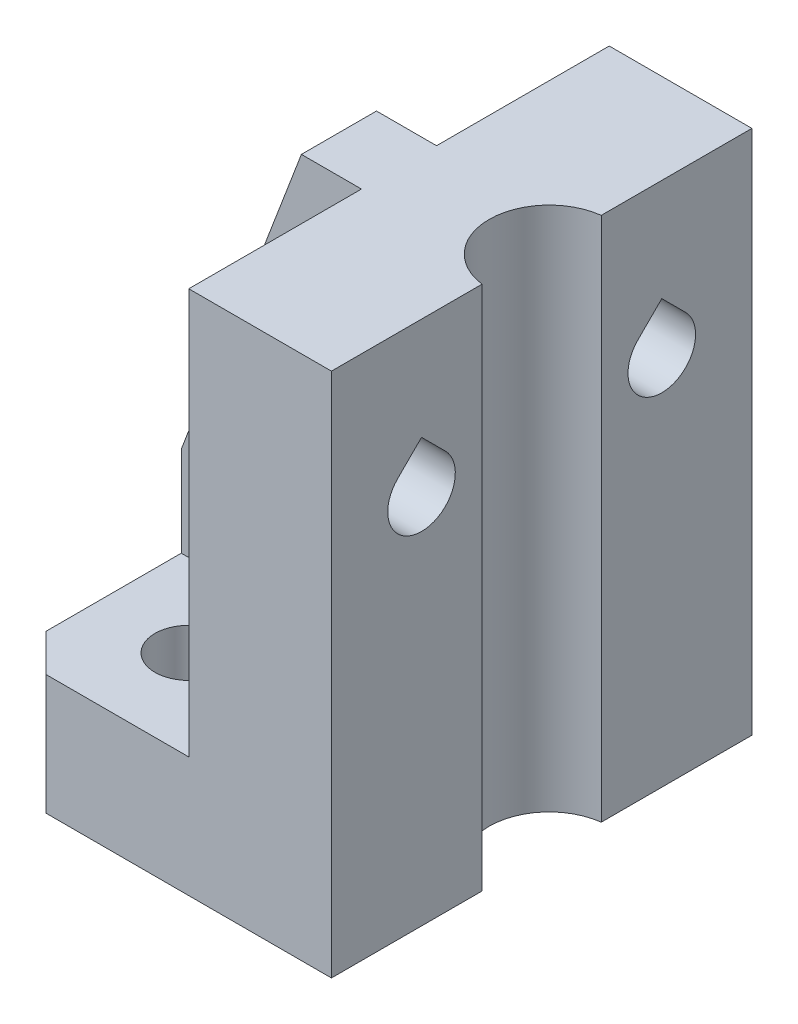
ISO-10303-21;
HEADER;
FILE_DESCRIPTION(('STEP AP214'),'2;1');
FILE_NAME('part.step','',(''),(''),'','','');
FILE_SCHEMA(('AUTOMOTIVE_DESIGN { 1 0 10303 214 1 1 1 1 }'));
ENDSEC;
DATA;
#1=APPLICATION_CONTEXT('core data for automotive mechanical design processes');
#2=APPLICATION_PROTOCOL_DEFINITION('international standard','automotive_design',2000,#1);
#3=PRODUCT_CONTEXT('',#1,'mechanical');
#4=PRODUCT('Part','Part','',(#3));
#5=PRODUCT_RELATED_PRODUCT_CATEGORY('part','',(#4));
#6=PRODUCT_DEFINITION_FORMATION('','',#4);
#7=PRODUCT_DEFINITION_CONTEXT('part definition',#1,'design');
#8=PRODUCT_DEFINITION('design','',#6,#7);
#9=PRODUCT_DEFINITION_SHAPE('','',#8);
#10=(LENGTH_UNIT() NAMED_UNIT(*) SI_UNIT(.MILLI.,.METRE.));
#11=(NAMED_UNIT(*) PLANE_ANGLE_UNIT() SI_UNIT($,.RADIAN.));
#12=(NAMED_UNIT(*) SI_UNIT($,.STERADIAN.) SOLID_ANGLE_UNIT());
#13=UNCERTAINTY_MEASURE_WITH_UNIT(LENGTH_MEASURE(1.E-05),#10,'distance_accuracy_value','');
#14=(GEOMETRIC_REPRESENTATION_CONTEXT(3) GLOBAL_UNCERTAINTY_ASSIGNED_CONTEXT((#13)) GLOBAL_UNIT_ASSIGNED_CONTEXT((#10,
#11,#12)) REPRESENTATION_CONTEXT('',''));
#15=CARTESIAN_POINT('',(0.,0.,0.));
#16=DIRECTION('',(0.,0.,1.));
#17=DIRECTION('',(1.,0.,0.));
#18=AXIS2_PLACEMENT_3D('',#15,#16,#17);
#19=CARTESIAN_POINT('',(-10.,35.,14.));
#20=DIRECTION('',(1.,0.,0.));
#21=DIRECTION('',(0.,1.,0.));
#22=AXIS2_PLACEMENT_3D('',#19,#20,#21);
#23=PLANE('',#22);
#24=DIRECTION('',(0.,0.707106781186547,-0.707106781186547));
#25=VECTOR('',#24,1.);
#26=CARTESIAN_POINT('',(-10.,28.1819805153395,7.99999999999999));
#27=LINE('',#26,#25);
#28=CARTESIAN_POINT('',(-10.,26.5909902576697,9.59099025766972));
#29=VERTEX_POINT('',#28);
#30=CARTESIAN_POINT('',(-10.,28.1819805153395,7.99999999999999));
#31=VERTEX_POINT('',#30);
#32=EDGE_CURVE('E310',#29,#31,#27,.T.);
#33=ORIENTED_EDGE('',*,*,#32,.F.);
#34=CARTESIAN_POINT('',(-10.,25.,7.99999999999999));
#35=DIRECTION('',(-1.,0.,0.));
#36=DIRECTION('',(0.,0.,1.));
#37=AXIS2_PLACEMENT_3D('',#34,#35,#36);
#38=CIRCLE('',#37,2.25);
#39=CARTESIAN_POINT('',(-10.,26.5909902576697,6.40900974233026));
#40=VERTEX_POINT('',#39);
#41=EDGE_CURVE('E313',#40,#29,#38,.T.);
#42=ORIENTED_EDGE('',*,*,#41,.F.);
#43=DIRECTION('',(0.,-0.707106781186549,-0.707106781186547));
#44=VECTOR('',#43,1.);
#45=CARTESIAN_POINT('',(-10.,26.5909902576697,6.40900974233026));
#46=LINE('',#45,#44);
#47=EDGE_CURVE('E306',#31,#40,#46,.T.);
#48=ORIENTED_EDGE('',*,*,#47,.F.);
#49=EDGE_LOOP('',(#33,#42,#48));
#50=FACE_BOUND('',#49,.T.);
#51=DIRECTION('',(0.,1.,0.));
#52=VECTOR('',#51,1.);
#53=CARTESIAN_POINT('',(-10.,35.,2.5));
#54=LINE('',#53,#52);
#55=CARTESIAN_POINT('',(-10.,7.99999999999999,2.5));
#56=VERTEX_POINT('',#55);
#57=CARTESIAN_POINT('',(-10.,35.,2.5));
#58=VERTEX_POINT('',#57);
#59=EDGE_CURVE('E184',#56,#58,#54,.T.);
#60=ORIENTED_EDGE('',*,*,#59,.F.);
#61=DIRECTION('',(0.,0.,-1.));
#62=VECTOR('',#61,1.);
#63=CARTESIAN_POINT('',(-10.,7.99999999999999,14.));
#64=LINE('',#63,#62);
#65=CARTESIAN_POINT('',(-10.,7.99999999999999,14.));
#66=VERTEX_POINT('',#65);
#67=EDGE_CURVE('E196',#66,#56,#64,.T.);
#68=ORIENTED_EDGE('',*,*,#67,.F.);
#69=DIRECTION('',(0.,-1.,0.));
#70=VECTOR('',#69,1.);
#71=CARTESIAN_POINT('',(-10.,35.,14.));
#72=LINE('',#71,#70);
#73=CARTESIAN_POINT('',(-10.,35.,14.));
#74=VERTEX_POINT('',#73);
#75=EDGE_CURVE('E269',#74,#66,#72,.T.);
#76=ORIENTED_EDGE('',*,*,#75,.F.);
#77=DIRECTION('',(0.,0.,-1.));
#78=VECTOR('',#77,1.);
#79=CARTESIAN_POINT('',(-10.,35.,14.));
#80=LINE('',#79,#78);
#81=EDGE_CURVE('E198',#74,#58,#80,.T.);
#82=ORIENTED_EDGE('',*,*,#81,.T.);
#83=EDGE_LOOP('',(#60,#68,#76,#82));
#84=FACE_BOUND('',#83,.T.);
#85=ADVANCED_FACE('F36',(#50,#84),#23,.F.);
#86=CARTESIAN_POINT('',(-22.,8.,14.));
#87=DIRECTION('',(0.,-1.,0.));
#88=DIRECTION('',(1.,0.,0.));
#89=AXIS2_PLACEMENT_3D('',#86,#87,#88);
#90=PLANE('',#89);
#91=CARTESIAN_POINT('',(-16.,7.99999999999999,8.));
#92=DIRECTION('',(0.,1.,0.));
#93=DIRECTION('',(-1.,0.,0.));
#94=AXIS2_PLACEMENT_3D('',#91,#92,#93);
#95=CIRCLE('',#94,2.25);
#96=CARTESIAN_POINT('',(-18.25,7.99999999999999,8.));
#97=VERTEX_POINT('',#96);
#98=EDGE_CURVE('E293',#97,#97,#95,.T.);
#99=ORIENTED_EDGE('',*,*,#98,.F.);
#100=EDGE_LOOP('',(#99));
#101=FACE_BOUND('',#100,.T.);
#102=DIRECTION('',(1.,0.,0.));
#103=VECTOR('',#102,1.);
#104=CARTESIAN_POINT('',(-10.,7.99999999999999,2.5));
#105=LINE('',#104,#103);
#106=CARTESIAN_POINT('',(-22.,8.,2.5));
#107=VERTEX_POINT('',#106);
#108=EDGE_CURVE('E181',#107,#56,#105,.T.);
#109=ORIENTED_EDGE('',*,*,#108,.F.);
#110=DIRECTION('',(0.,0.,-1.));
#111=VECTOR('',#110,1.);
#112=CARTESIAN_POINT('',(-22.,8.,14.));
#113=LINE('',#112,#111);
#114=CARTESIAN_POINT('',(-22.,8.,11.5));
#115=VERTEX_POINT('',#114);
#116=EDGE_CURVE('E207',#115,#107,#113,.T.);
#117=ORIENTED_EDGE('',*,*,#116,.F.);
#118=DIRECTION('',(0.707106781186547,0.,0.707106781186549));
#119=VECTOR('',#118,1.);
#120=CARTESIAN_POINT('',(-19.5,8.,14.));
#121=LINE('',#120,#119);
#122=CARTESIAN_POINT('',(-19.5,8.,14.));
#123=VERTEX_POINT('',#122);
#124=EDGE_CURVE('E59',#115,#123,#121,.T.);
#125=ORIENTED_EDGE('',*,*,#124,.T.);
#126=DIRECTION('',(-1.,0.,0.));
#127=VECTOR('',#126,1.);
#128=CARTESIAN_POINT('',(-22.,8.,14.));
#129=LINE('',#128,#127);
#130=EDGE_CURVE('E202',#66,#123,#129,.T.);
#131=ORIENTED_EDGE('',*,*,#130,.F.);
#132=ORIENTED_EDGE('',*,*,#67,.T.);
#133=EDGE_LOOP('',(#109,#117,#125,#131,#132));
#134=FACE_BOUND('',#133,.T.);
#135=ADVANCED_FACE('F201',(#101,#134),#90,.F.);
#136=CARTESIAN_POINT('',(0.,35.,14.));
#137=DIRECTION('',(0.,-1.,0.));
#138=DIRECTION('',(0.,0.,-1.));
#139=AXIS2_PLACEMENT_3D('',#136,#137,#138);
#140=PLANE('',#139);
#141=DIRECTION('',(-1.,0.,0.));
#142=VECTOR('',#141,1.);
#143=CARTESIAN_POINT('',(0.,35.,14.));
#144=LINE('',#143,#142);
#145=CARTESIAN_POINT('',(-0.499999999999997,35.,14.));
#146=VERTEX_POINT('',#145);
#147=EDGE_CURVE('E259',#146,#74,#144,.T.);
#148=ORIENTED_EDGE('',*,*,#147,.F.);
#149=DIRECTION('',(0.,0.,1.));
#150=VECTOR('',#149,1.);
#151=CARTESIAN_POINT('',(-0.5,35.,-14.));
#152=LINE('',#151,#150);
#153=CARTESIAN_POINT('',(-0.499999999999998,35.,3.96862696659689));
#154=VERTEX_POINT('',#153);
#155=EDGE_CURVE('E283',#154,#146,#152,.T.);
#156=ORIENTED_EDGE('',*,*,#155,.F.);
#157=CARTESIAN_POINT('',(0.,35.,0.));
#158=DIRECTION('',(0.,1.,0.));
#159=DIRECTION('',(-1.,0.,0.));
#160=AXIS2_PLACEMENT_3D('',#157,#158,#159);
#161=CIRCLE('',#160,4.);
#162=CARTESIAN_POINT('',(-0.499999999999999,35.,-3.96862696659689));
#163=VERTEX_POINT('',#162);
#164=EDGE_CURVE('E266',#163,#154,#161,.T.);
#165=ORIENTED_EDGE('',*,*,#164,.F.);
#166=CARTESIAN_POINT('',(-0.5,35.,-14.));
#167=VERTEX_POINT('',#166);
#168=EDGE_CURVE('E280',#167,#163,#152,.T.);
#169=ORIENTED_EDGE('',*,*,#168,.F.);
#170=DIRECTION('',(-1.,0.,0.));
#171=VECTOR('',#170,1.);
#172=CARTESIAN_POINT('',(0.,35.,-14.));
#173=LINE('',#172,#171);
#174=CARTESIAN_POINT('',(-10.,35.,-14.));
#175=VERTEX_POINT('',#174);
#176=EDGE_CURVE('E264',#167,#175,#173,.T.);
#177=ORIENTED_EDGE('',*,*,#176,.T.);
#178=CARTESIAN_POINT('',(-10.,35.,-2.5));
#179=VERTEX_POINT('',#178);
#180=EDGE_CURVE('E203',#179,#175,#80,.T.);
#181=ORIENTED_EDGE('',*,*,#180,.F.);
#182=DIRECTION('',(-1.,0.,0.));
#183=VECTOR('',#182,1.);
#184=CARTESIAN_POINT('',(-14.,35.,-2.5));
#185=LINE('',#184,#183);
#186=CARTESIAN_POINT('',(-14.,35.,-2.5));
#187=VERTEX_POINT('',#186);
#188=EDGE_CURVE('E355',#179,#187,#185,.T.);
#189=ORIENTED_EDGE('',*,*,#188,.T.);
#190=DIRECTION('',(0.,0.,-1.));
#191=VECTOR('',#190,1.);
#192=CARTESIAN_POINT('',(-14.,35.,2.5));
#193=LINE('',#192,#191);
#194=CARTESIAN_POINT('',(-14.,35.,2.5));
#195=VERTEX_POINT('',#194);
#196=EDGE_CURVE('E339',#195,#187,#193,.T.);
#197=ORIENTED_EDGE('',*,*,#196,.F.);
#198=DIRECTION('',(-1.,0.,0.));
#199=VECTOR('',#198,1.);
#200=CARTESIAN_POINT('',(-14.,35.,2.5));
#201=LINE('',#200,#199);
#202=EDGE_CURVE('E199',#58,#195,#201,.T.);
#203=ORIENTED_EDGE('',*,*,#202,.F.);
#204=ORIENTED_EDGE('',*,*,#81,.F.);
#205=EDGE_LOOP('',(#148,#156,#165,#169,#177,#181,#189,#197,#203,#204));
#206=FACE_BOUND('',#205,.T.);
#207=ADVANCED_FACE('F369',(#206),#140,.F.);
#208=DIRECTION('',(0.,0.707106781186549,-0.707106781186546));
#209=VECTOR('',#208,1.);
#210=CARTESIAN_POINT('',(-10.,28.1819805153395,-8.00000000000001));
#211=LINE('',#210,#209);
#212=CARTESIAN_POINT('',(-10.,26.5909902576697,-6.40900974233028));
#213=VERTEX_POINT('',#212);
#214=CARTESIAN_POINT('',(-10.,28.1819805153395,-8.00000000000001));
#215=VERTEX_POINT('',#214);
#216=EDGE_CURVE('E334',#213,#215,#211,.T.);
#217=ORIENTED_EDGE('',*,*,#216,.F.);
#218=CARTESIAN_POINT('',(-10.,25.,-8.00000000000001));
#219=DIRECTION('',(-1.,0.,0.));
#220=DIRECTION('',(0.,0.,1.));
#221=AXIS2_PLACEMENT_3D('',#218,#219,#220);
#222=CIRCLE('',#221,2.25);
#223=CARTESIAN_POINT('',(-10.,26.5909902576697,-9.59099025766974));
#224=VERTEX_POINT('',#223);
#225=EDGE_CURVE('E337',#224,#213,#222,.T.);
#226=ORIENTED_EDGE('',*,*,#225,.F.);
#227=DIRECTION('',(0.,-0.707106781186547,-0.707106781186547));
#228=VECTOR('',#227,1.);
#229=CARTESIAN_POINT('',(-10.,26.5909902576697,-9.59099025766974));
#230=LINE('',#229,#228);
#231=EDGE_CURVE('E330',#215,#224,#230,.T.);
#232=ORIENTED_EDGE('',*,*,#231,.F.);
#233=EDGE_LOOP('',(#217,#226,#232));
#234=FACE_BOUND('',#233,.T.);
#235=CARTESIAN_POINT('',(-10.,7.99999999999999,-2.5));
#236=VERTEX_POINT('',#235);
#237=CARTESIAN_POINT('',(-10.,7.99999999999999,-14.));
#238=VERTEX_POINT('',#237);
#239=EDGE_CURVE('E204',#236,#238,#64,.T.);
#240=ORIENTED_EDGE('',*,*,#239,.F.);
#241=DIRECTION('',(0.,1.,0.));
#242=VECTOR('',#241,1.);
#243=CARTESIAN_POINT('',(-10.,35.,-2.5));
#244=LINE('',#243,#242);
#245=EDGE_CURVE('E357',#236,#179,#244,.T.);
#246=ORIENTED_EDGE('',*,*,#245,.T.);
#247=ORIENTED_EDGE('',*,*,#180,.T.);
#248=DIRECTION('',(0.,-1.,0.));
#249=VECTOR('',#248,1.);
#250=CARTESIAN_POINT('',(-10.,35.,-14.));
#251=LINE('',#250,#249);
#252=EDGE_CURVE('E261',#175,#238,#251,.T.);
#253=ORIENTED_EDGE('',*,*,#252,.T.);
#254=EDGE_LOOP('',(#240,#246,#247,#253));
#255=FACE_BOUND('',#254,.T.);
#256=ADVANCED_FACE('F396',(#234,#255),#23,.F.);
#257=CARTESIAN_POINT('',(-16.,7.99999999999999,-8.));
#258=DIRECTION('',(0.,1.,0.));
#259=DIRECTION('',(-1.,0.,0.));
#260=AXIS2_PLACEMENT_3D('',#257,#258,#259);
#261=CIRCLE('',#260,2.25);
#262=CARTESIAN_POINT('',(-18.25,7.99999999999999,-8.));
#263=VERTEX_POINT('',#262);
#264=EDGE_CURVE('E286',#263,#263,#261,.T.);
#265=ORIENTED_EDGE('',*,*,#264,.F.);
#266=EDGE_LOOP('',(#265));
#267=FACE_BOUND('',#266,.T.);
#268=CARTESIAN_POINT('',(-22.,8.,-2.5));
#269=VERTEX_POINT('',#268);
#270=CARTESIAN_POINT('',(-22.,8.,-11.5));
#271=VERTEX_POINT('',#270);
#272=EDGE_CURVE('E238',#269,#271,#113,.T.);
#273=ORIENTED_EDGE('',*,*,#272,.F.);
#274=DIRECTION('',(1.,0.,0.));
#275=VECTOR('',#274,1.);
#276=CARTESIAN_POINT('',(-10.,7.99999999999999,-2.5));
#277=LINE('',#276,#275);
#278=EDGE_CURVE('E51',#269,#236,#277,.T.);
#279=ORIENTED_EDGE('',*,*,#278,.T.);
#280=ORIENTED_EDGE('',*,*,#239,.T.);
#281=DIRECTION('',(-1.,0.,0.));
#282=VECTOR('',#281,1.);
#283=CARTESIAN_POINT('',(-22.,8.,-14.));
#284=LINE('',#283,#282);
#285=CARTESIAN_POINT('',(-19.5,8.,-14.));
#286=VERTEX_POINT('',#285);
#287=EDGE_CURVE('E240',#238,#286,#284,.T.);
#288=ORIENTED_EDGE('',*,*,#287,.T.);
#289=DIRECTION('',(0.70710678118655,0.,-0.707106781186546));
#290=VECTOR('',#289,1.);
#291=CARTESIAN_POINT('',(-22.,8.,-11.5));
#292=LINE('',#291,#290);
#293=EDGE_CURVE('E44',#286,#271,#292,.F.);
#294=ORIENTED_EDGE('',*,*,#293,.T.);
#295=EDGE_LOOP('',(#273,#279,#280,#288,#294));
#296=FACE_BOUND('',#295,.T.);
#297=ADVANCED_FACE('F237',(#267,#296),#90,.F.);
#298=CARTESIAN_POINT('',(-22.,0.,14.));
#299=DIRECTION('',(1.,0.,0.));
#300=DIRECTION('',(0.,0.,-1.));
#301=AXIS2_PLACEMENT_3D('',#298,#299,#300);
#302=PLANE('',#301);
#303=ORIENTED_EDGE('',*,*,#116,.T.);
#304=DIRECTION('',(0.,-1.,0.));
#305=VECTOR('',#304,1.);
#306=CARTESIAN_POINT('',(-22.,8.,2.5));
#307=LINE('',#306,#305);
#308=CARTESIAN_POINT('',(-22.,14.,2.5));
#309=VERTEX_POINT('',#308);
#310=EDGE_CURVE('E187',#309,#107,#307,.T.);
#311=ORIENTED_EDGE('',*,*,#310,.F.);
#312=DIRECTION('',(0.,0.,-1.));
#313=VECTOR('',#312,1.);
#314=CARTESIAN_POINT('',(-22.,14.,2.5));
#315=LINE('',#314,#313);
#316=CARTESIAN_POINT('',(-22.,14.,-2.5));
#317=VERTEX_POINT('',#316);
#318=EDGE_CURVE('E349',#309,#317,#315,.T.);
#319=ORIENTED_EDGE('',*,*,#318,.T.);
#320=DIRECTION('',(0.,-1.,0.));
#321=VECTOR('',#320,1.);
#322=CARTESIAN_POINT('',(-22.,8.,-2.5));
#323=LINE('',#322,#321);
#324=EDGE_CURVE('E190',#317,#269,#323,.T.);
#325=ORIENTED_EDGE('',*,*,#324,.T.);
#326=ORIENTED_EDGE('',*,*,#272,.T.);
#327=DIRECTION('',(0.,-1.,0.));
#328=VECTOR('',#327,1.);
#329=CARTESIAN_POINT('',(-22.,0.,-11.5));
#330=LINE('',#329,#328);
#331=CARTESIAN_POINT('',(-22.,0.,-11.5));
#332=VERTEX_POINT('',#331);
#333=EDGE_CURVE('E222',#271,#332,#330,.T.);
#334=ORIENTED_EDGE('',*,*,#333,.T.);
#335=DIRECTION('',(0.,0.,-1.));
#336=VECTOR('',#335,1.);
#337=CARTESIAN_POINT('',(-22.,0.,14.));
#338=LINE('',#337,#336);
#339=CARTESIAN_POINT('',(-22.,0.,11.5));
#340=VERTEX_POINT('',#339);
#341=EDGE_CURVE('E248',#340,#332,#338,.T.);
#342=ORIENTED_EDGE('',*,*,#341,.F.);
#343=DIRECTION('',(0.,1.,0.));
#344=VECTOR('',#343,1.);
#345=CARTESIAN_POINT('',(-22.,8.,11.5));
#346=LINE('',#345,#344);
#347=EDGE_CURVE('E220',#340,#115,#346,.T.);
#348=ORIENTED_EDGE('',*,*,#347,.T.);
#349=EDGE_LOOP('',(#303,#311,#319,#325,#326,#334,#342,#348));
#350=FACE_BOUND('',#349,.T.);
#351=ADVANCED_FACE('F247',(#350),#302,.F.);
#352=CARTESIAN_POINT('',(0.,0.,14.));
#353=DIRECTION('',(0.,1.,0.));
#354=DIRECTION('',(-1.,0.,0.));
#355=AXIS2_PLACEMENT_3D('',#352,#353,#354);
#356=PLANE('',#355);
#357=CARTESIAN_POINT('',(-16.,0.,8.));
#358=DIRECTION('',(0.,1.,0.));
#359=DIRECTION('',(-1.,0.,0.));
#360=AXIS2_PLACEMENT_3D('',#357,#358,#359);
#361=CIRCLE('',#360,2.25);
#362=CARTESIAN_POINT('',(-18.25,0.,8.));
#363=VERTEX_POINT('',#362);
#364=EDGE_CURVE('E290',#363,#363,#361,.T.);
#365=ORIENTED_EDGE('',*,*,#364,.T.);
#366=EDGE_LOOP('',(#365));
#367=FACE_BOUND('',#366,.T.);
#368=CARTESIAN_POINT('',(-16.,0.,-8.));
#369=DIRECTION('',(0.,1.,0.));
#370=DIRECTION('',(-1.,0.,0.));
#371=AXIS2_PLACEMENT_3D('',#368,#369,#370);
#372=CIRCLE('',#371,2.25);
#373=CARTESIAN_POINT('',(-18.25,0.,-8.));
#374=VERTEX_POINT('',#373);
#375=EDGE_CURVE('E289',#374,#374,#372,.T.);
#376=ORIENTED_EDGE('',*,*,#375,.T.);
#377=EDGE_LOOP('',(#376));
#378=FACE_BOUND('',#377,.T.);
#379=ORIENTED_EDGE('',*,*,#341,.T.);
#380=DIRECTION('',(-0.70710678118655,0.,0.707106781186546));
#381=VECTOR('',#380,1.);
#382=CARTESIAN_POINT('',(-22.,0.,-11.5));
#383=LINE('',#382,#381);
#384=CARTESIAN_POINT('',(-19.5,0.,-14.));
#385=VERTEX_POINT('',#384);
#386=EDGE_CURVE('E227',#332,#385,#383,.F.);
#387=ORIENTED_EDGE('',*,*,#386,.T.);
#388=DIRECTION('',(1.,0.,0.));
#389=VECTOR('',#388,1.);
#390=CARTESIAN_POINT('',(0.,0.,-14.));
#391=LINE('',#390,#389);
#392=CARTESIAN_POINT('',(-0.499999999999939,0.,-14.));
#393=VERTEX_POINT('',#392);
#394=EDGE_CURVE('E257',#385,#393,#391,.T.);
#395=ORIENTED_EDGE('',*,*,#394,.T.);
#396=DIRECTION('',(0.,0.,1.));
#397=VECTOR('',#396,1.);
#398=CARTESIAN_POINT('',(-0.499999999999939,0.,-14.));
#399=LINE('',#398,#397);
#400=CARTESIAN_POINT('',(-0.499999999999938,0.,-3.96862696659689));
#401=VERTEX_POINT('',#400);
#402=EDGE_CURVE('E277',#393,#401,#399,.T.);
#403=ORIENTED_EDGE('',*,*,#402,.T.);
#404=CARTESIAN_POINT('',(0.,0.,0.));
#405=DIRECTION('',(0.,1.,0.));
#406=DIRECTION('',(-1.,0.,0.));
#407=AXIS2_PLACEMENT_3D('',#404,#405,#406);
#408=CIRCLE('',#407,4.);
#409=CARTESIAN_POINT('',(-0.499999999999937,0.,3.96862696659689));
#410=VERTEX_POINT('',#409);
#411=EDGE_CURVE('E211',#401,#410,#408,.T.);
#412=ORIENTED_EDGE('',*,*,#411,.T.);
#413=CARTESIAN_POINT('',(-0.499999999999936,0.,14.));
#414=VERTEX_POINT('',#413);
#415=EDGE_CURVE('E282',#410,#414,#399,.T.);
#416=ORIENTED_EDGE('',*,*,#415,.T.);
#417=DIRECTION('',(1.,0.,0.));
#418=VECTOR('',#417,1.);
#419=CARTESIAN_POINT('',(0.,0.,14.));
#420=LINE('',#419,#418);
#421=CARTESIAN_POINT('',(-19.5,0.,14.));
#422=VERTEX_POINT('',#421);
#423=EDGE_CURVE('E254',#422,#414,#420,.T.);
#424=ORIENTED_EDGE('',*,*,#423,.F.);
#425=DIRECTION('',(-0.707106781186547,0.,-0.707106781186549));
#426=VECTOR('',#425,1.);
#427=CARTESIAN_POINT('',(-19.5,0.,14.));
#428=LINE('',#427,#426);
#429=EDGE_CURVE('E225',#422,#340,#428,.T.);
#430=ORIENTED_EDGE('',*,*,#429,.T.);
#431=EDGE_LOOP('',(#379,#387,#395,#403,#412,#416,#424,#430));
#432=FACE_BOUND('',#431,.T.);
#433=ADVANCED_FACE('F251',(#367,#378,#432),#356,.F.);
#434=CARTESIAN_POINT('',(0.,0.,14.));
#435=DIRECTION('',(0.,0.,1.));
#436=DIRECTION('',(1.,0.,0.));
#437=AXIS2_PLACEMENT_3D('',#434,#435,#436);
#438=PLANE('',#437);
#439=ORIENTED_EDGE('',*,*,#130,.T.);
#440=DIRECTION('',(0.,-1.,0.));
#441=VECTOR('',#440,1.);
#442=CARTESIAN_POINT('',(-19.5,0.,14.));
#443=LINE('',#442,#441);
#444=EDGE_CURVE('E11',#123,#422,#443,.T.);
#445=ORIENTED_EDGE('',*,*,#444,.T.);
#446=ORIENTED_EDGE('',*,*,#423,.T.);
#447=DIRECTION('',(0.,1.,0.));
#448=VECTOR('',#447,1.);
#449=CARTESIAN_POINT('',(-0.499999999999936,0.,14.));
#450=LINE('',#449,#448);
#451=EDGE_CURVE('E274',#414,#146,#450,.T.);
#452=ORIENTED_EDGE('',*,*,#451,.T.);
#453=ORIENTED_EDGE('',*,*,#147,.T.);
#454=ORIENTED_EDGE('',*,*,#75,.T.);
#455=EDGE_LOOP('',(#439,#445,#446,#452,#453,#454));
#456=FACE_BOUND('',#455,.T.);
#457=ADVANCED_FACE('F377',(#456),#438,.T.);
#458=CARTESIAN_POINT('',(0.,0.,-14.));
#459=DIRECTION('',(0.,0.,1.));
#460=DIRECTION('',(1.,0.,0.));
#461=AXIS2_PLACEMENT_3D('',#458,#459,#460);
#462=PLANE('',#461);
#463=ORIENTED_EDGE('',*,*,#394,.F.);
#464=DIRECTION('',(0.,1.,0.));
#465=VECTOR('',#464,1.);
#466=CARTESIAN_POINT('',(-19.5,0.,-14.));
#467=LINE('',#466,#465);
#468=EDGE_CURVE('E229',#385,#286,#467,.T.);
#469=ORIENTED_EDGE('',*,*,#468,.T.);
#470=ORIENTED_EDGE('',*,*,#287,.F.);
#471=ORIENTED_EDGE('',*,*,#252,.F.);
#472=ORIENTED_EDGE('',*,*,#176,.F.);
#473=DIRECTION('',(0.,1.,0.));
#474=VECTOR('',#473,1.);
#475=CARTESIAN_POINT('',(-0.499999999999939,0.,-14.));
#476=LINE('',#475,#474);
#477=EDGE_CURVE('E275',#393,#167,#476,.T.);
#478=ORIENTED_EDGE('',*,*,#477,.F.);
#479=EDGE_LOOP('',(#463,#469,#470,#471,#472,#478));
#480=FACE_BOUND('',#479,.T.);
#481=ADVANCED_FACE('F393',(#480),#462,.F.);
#482=CARTESIAN_POINT('',(0.,0.,0.));
#483=DIRECTION('',(0.,1.,0.));
#484=DIRECTION('',(-1.,0.,0.));
#485=AXIS2_PLACEMENT_3D('',#482,#483,#484);
#486=CYLINDRICAL_SURFACE('',#485,4.);
#487=ORIENTED_EDGE('',*,*,#164,.T.);
#488=DIRECTION('',(0.,1.,0.));
#489=VECTOR('',#488,1.);
#490=CARTESIAN_POINT('',(-0.499999999999937,0.,3.96862696659689));
#491=LINE('',#490,#489);
#492=EDGE_CURVE('E217',#154,#410,#491,.F.);
#493=ORIENTED_EDGE('',*,*,#492,.T.);
#494=ORIENTED_EDGE('',*,*,#411,.F.);
#495=DIRECTION('',(0.,1.,0.));
#496=VECTOR('',#495,1.);
#497=CARTESIAN_POINT('',(-0.499999999999938,0.,-3.96862696659689));
#498=LINE('',#497,#496);
#499=EDGE_CURVE('E214',#401,#163,#498,.T.);
#500=ORIENTED_EDGE('',*,*,#499,.T.);
#501=EDGE_LOOP('',(#487,#493,#494,#500));
#502=FACE_BOUND('',#501,.T.);
#503=ADVANCED_FACE('F385',(#502),#486,.F.);
#504=CARTESIAN_POINT('',(-0.499999999999939,0.,-14.));
#505=DIRECTION('',(-1.,0.,0.));
#506=DIRECTION('',(0.,-1.,0.));
#507=AXIS2_PLACEMENT_3D('',#504,#505,#506);
#508=PLANE('',#507);
#509=DIRECTION('',(0.,-0.707106781186547,-0.707106781186547));
#510=VECTOR('',#509,1.);
#511=CARTESIAN_POINT('',(-0.499999999999936,26.5909902576697,-9.59099025766974));
#512=LINE('',#511,#510);
#513=CARTESIAN_POINT('',(-0.499999999999988,28.1819805153395,-8.00000000000001));
#514=VERTEX_POINT('',#513);
#515=CARTESIAN_POINT('',(-0.499999999999936,26.5909902576697,-9.59099025766974));
#516=VERTEX_POINT('',#515);
#517=EDGE_CURVE('E327',#514,#516,#512,.T.);
#518=ORIENTED_EDGE('',*,*,#517,.T.);
#519=CARTESIAN_POINT('',(-0.499999999999936,25.,-8.00000000000001));
#520=DIRECTION('',(-1.,0.,0.));
#521=DIRECTION('',(0.,0.,1.));
#522=AXIS2_PLACEMENT_3D('',#519,#520,#521);
#523=CIRCLE('',#522,2.25);
#524=CARTESIAN_POINT('',(-0.499999999999936,26.5909902576697,-6.40900974233028));
#525=VERTEX_POINT('',#524);
#526=EDGE_CURVE('E333',#516,#525,#523,.T.);
#527=ORIENTED_EDGE('',*,*,#526,.T.);
#528=DIRECTION('',(0.,0.707106781186549,-0.707106781186546));
#529=VECTOR('',#528,1.);
#530=CARTESIAN_POINT('',(-0.499999999999936,28.1819805153395,-8.00000000000001));
#531=LINE('',#530,#529);
#532=EDGE_CURVE('E342',#525,#514,#531,.T.);
#533=ORIENTED_EDGE('',*,*,#532,.T.);
#534=EDGE_LOOP('',(#518,#527,#533));
#535=FACE_BOUND('',#534,.T.);
#536=ORIENTED_EDGE('',*,*,#402,.F.);
#537=ORIENTED_EDGE('',*,*,#477,.T.);
#538=ORIENTED_EDGE('',*,*,#168,.T.);
#539=ORIENTED_EDGE('',*,*,#499,.F.);
#540=EDGE_LOOP('',(#536,#537,#538,#539));
#541=FACE_BOUND('',#540,.T.);
#542=ADVANCED_FACE('F435',(#535,#541),#508,.F.);
#543=DIRECTION('',(0.,-0.707106781186549,-0.707106781186547));
#544=VECTOR('',#543,1.);
#545=CARTESIAN_POINT('',(-0.499999999999936,26.5909902576697,6.40900974233026));
#546=LINE('',#545,#544);
#547=CARTESIAN_POINT('',(-0.499999999999986,28.1819805153395,7.99999999999999));
#548=VERTEX_POINT('',#547);
#549=CARTESIAN_POINT('',(-0.499999999999936,26.5909902576697,6.40900974233026));
#550=VERTEX_POINT('',#549);
#551=EDGE_CURVE('E303',#548,#550,#546,.T.);
#552=ORIENTED_EDGE('',*,*,#551,.T.);
#553=CARTESIAN_POINT('',(-0.499999999999936,25.,7.99999999999999));
#554=DIRECTION('',(-1.,0.,0.));
#555=DIRECTION('',(0.,0.,1.));
#556=AXIS2_PLACEMENT_3D('',#553,#554,#555);
#557=CIRCLE('',#556,2.25);
#558=CARTESIAN_POINT('',(-0.499999999999936,26.5909902576697,9.59099025766972));
#559=VERTEX_POINT('',#558);
#560=EDGE_CURVE('E309',#550,#559,#557,.T.);
#561=ORIENTED_EDGE('',*,*,#560,.T.);
#562=DIRECTION('',(0.,0.707106781186547,-0.707106781186547));
#563=VECTOR('',#562,1.);
#564=CARTESIAN_POINT('',(-0.499999999999936,28.1819805153395,7.99999999999999));
#565=LINE('',#564,#563);
#566=EDGE_CURVE('E318',#559,#548,#565,.T.);
#567=ORIENTED_EDGE('',*,*,#566,.T.);
#568=EDGE_LOOP('',(#552,#561,#567));
#569=FACE_BOUND('',#568,.T.);
#570=ORIENTED_EDGE('',*,*,#155,.T.);
#571=ORIENTED_EDGE('',*,*,#451,.F.);
#572=ORIENTED_EDGE('',*,*,#415,.F.);
#573=ORIENTED_EDGE('',*,*,#492,.F.);
#574=EDGE_LOOP('',(#570,#571,#572,#573));
#575=FACE_BOUND('',#574,.T.);
#576=ADVANCED_FACE('F382',(#569,#575),#508,.F.);
#577=CARTESIAN_POINT('',(-16.,0.,-8.));
#578=DIRECTION('',(0.,1.,0.));
#579=DIRECTION('',(-1.,0.,0.));
#580=AXIS2_PLACEMENT_3D('',#577,#578,#579);
#581=CYLINDRICAL_SURFACE('',#580,2.25);
#582=ORIENTED_EDGE('',*,*,#375,.F.);
#583=EDGE_LOOP('',(#582));
#584=FACE_BOUND('',#583,.T.);
#585=ORIENTED_EDGE('',*,*,#264,.T.);
#586=EDGE_LOOP('',(#585));
#587=FACE_BOUND('',#586,.T.);
#588=ADVANCED_FACE('F443',(#584,#587),#581,.F.);
#589=CARTESIAN_POINT('',(-16.,0.,8.));
#590=DIRECTION('',(0.,1.,0.));
#591=DIRECTION('',(-1.,0.,0.));
#592=AXIS2_PLACEMENT_3D('',#589,#590,#591);
#593=CYLINDRICAL_SURFACE('',#592,2.25);
#594=ORIENTED_EDGE('',*,*,#364,.F.);
#595=EDGE_LOOP('',(#594));
#596=FACE_BOUND('',#595,.T.);
#597=ORIENTED_EDGE('',*,*,#98,.T.);
#598=EDGE_LOOP('',(#597));
#599=FACE_BOUND('',#598,.T.);
#600=ADVANCED_FACE('F490',(#596,#599),#593,.F.);
#601=CARTESIAN_POINT('',(-0.499999999999936,25.,7.99999999999999));
#602=DIRECTION('',(-1.,0.,0.));
#603=DIRECTION('',(0.,0.,1.));
#604=AXIS2_PLACEMENT_3D('',#601,#602,#603);
#605=CYLINDRICAL_SURFACE('',#604,2.25);
#606=ORIENTED_EDGE('',*,*,#41,.T.);
#607=DIRECTION('',(-1.,0.,0.));
#608=VECTOR('',#607,1.);
#609=CARTESIAN_POINT('',(-0.499999999999936,26.5909902576697,9.59099025766972));
#610=LINE('',#609,#608);
#611=EDGE_CURVE('E299',#559,#29,#610,.T.);
#612=ORIENTED_EDGE('',*,*,#611,.F.);
#613=ORIENTED_EDGE('',*,*,#560,.F.);
#614=DIRECTION('',(-1.,0.,0.));
#615=VECTOR('',#614,1.);
#616=CARTESIAN_POINT('',(-0.499999999999936,26.5909902576697,6.40900974233026));
#617=LINE('',#616,#615);
#618=EDGE_CURVE('E296',#550,#40,#617,.T.);
#619=ORIENTED_EDGE('',*,*,#618,.T.);
#620=EDGE_LOOP('',(#606,#612,#613,#619));
#621=FACE_BOUND('',#620,.T.);
#622=ADVANCED_FACE('F499',(#621),#605,.F.);
#623=CARTESIAN_POINT('',(-0.499999999999936,26.5909902576697,6.40900974233026));
#624=DIRECTION('',(0.,0.707106781186547,-0.707106781186549));
#625=DIRECTION('',(0.,0.707106781186549,0.707106781186547));
#626=AXIS2_PLACEMENT_3D('',#623,#624,#625);
#627=PLANE('',#626);
#628=ORIENTED_EDGE('',*,*,#47,.T.);
#629=ORIENTED_EDGE('',*,*,#618,.F.);
#630=ORIENTED_EDGE('',*,*,#551,.F.);
#631=DIRECTION('',(-1.,0.,0.));
#632=VECTOR('',#631,1.);
#633=CARTESIAN_POINT('',(-0.499999999999936,28.1819805153395,7.99999999999999));
#634=LINE('',#633,#632);
#635=EDGE_CURVE('E302',#548,#31,#634,.T.);
#636=ORIENTED_EDGE('',*,*,#635,.T.);
#637=EDGE_LOOP('',(#628,#629,#630,#636));
#638=FACE_BOUND('',#637,.T.);
#639=ADVANCED_FACE('F517',(#638),#627,.F.);
#640=CARTESIAN_POINT('',(-0.499999999999936,28.1819805153395,7.99999999999999));
#641=DIRECTION('',(0.,0.707106781186547,0.707106781186547));
#642=DIRECTION('',(0.,-0.707106781186548,0.707106781186548));
#643=AXIS2_PLACEMENT_3D('',#640,#641,#642);
#644=PLANE('',#643);
#645=ORIENTED_EDGE('',*,*,#32,.T.);
#646=ORIENTED_EDGE('',*,*,#635,.F.);
#647=ORIENTED_EDGE('',*,*,#566,.F.);
#648=ORIENTED_EDGE('',*,*,#611,.T.);
#649=EDGE_LOOP('',(#645,#646,#647,#648));
#650=FACE_BOUND('',#649,.T.);
#651=ADVANCED_FACE('F527',(#650),#644,.F.);
#652=CARTESIAN_POINT('',(-0.499999999999936,25.,-8.00000000000001));
#653=DIRECTION('',(-1.,0.,0.));
#654=DIRECTION('',(0.,0.,1.));
#655=AXIS2_PLACEMENT_3D('',#652,#653,#654);
#656=CYLINDRICAL_SURFACE('',#655,2.25);
#657=ORIENTED_EDGE('',*,*,#225,.T.);
#658=DIRECTION('',(-1.,0.,0.));
#659=VECTOR('',#658,1.);
#660=CARTESIAN_POINT('',(-0.499999999999936,26.5909902576697,-6.40900974233028));
#661=LINE('',#660,#659);
#662=EDGE_CURVE('E323',#525,#213,#661,.T.);
#663=ORIENTED_EDGE('',*,*,#662,.F.);
#664=ORIENTED_EDGE('',*,*,#526,.F.);
#665=DIRECTION('',(-1.,0.,0.));
#666=VECTOR('',#665,1.);
#667=CARTESIAN_POINT('',(-0.499999999999936,26.5909902576697,-9.59099025766974));
#668=LINE('',#667,#666);
#669=EDGE_CURVE('E315',#516,#224,#668,.T.);
#670=ORIENTED_EDGE('',*,*,#669,.T.);
#671=EDGE_LOOP('',(#657,#663,#664,#670));
#672=FACE_BOUND('',#671,.T.);
#673=ADVANCED_FACE('F431',(#672),#656,.F.);
#674=CARTESIAN_POINT('',(-0.499999999999936,26.5909902576697,-9.59099025766974));
#675=DIRECTION('',(0.,0.707106781186547,-0.707106781186547));
#676=DIRECTION('',(0.,0.707106781186548,0.707106781186548));
#677=AXIS2_PLACEMENT_3D('',#674,#675,#676);
#678=PLANE('',#677);
#679=ORIENTED_EDGE('',*,*,#231,.T.);
#680=ORIENTED_EDGE('',*,*,#669,.F.);
#681=ORIENTED_EDGE('',*,*,#517,.F.);
#682=DIRECTION('',(-1.,0.,0.));
#683=VECTOR('',#682,1.);
#684=CARTESIAN_POINT('',(-0.499999999999936,28.1819805153395,-8.00000000000001));
#685=LINE('',#684,#683);
#686=EDGE_CURVE('E326',#514,#215,#685,.T.);
#687=ORIENTED_EDGE('',*,*,#686,.T.);
#688=EDGE_LOOP('',(#679,#680,#681,#687));
#689=FACE_BOUND('',#688,.T.);
#690=ADVANCED_FACE('F433',(#689),#678,.F.);
#691=CARTESIAN_POINT('',(-0.499999999999936,28.1819805153395,-8.00000000000001));
#692=DIRECTION('',(0.,0.707106781186546,0.707106781186549));
#693=DIRECTION('',(0.,-0.707106781186549,0.707106781186546));
#694=AXIS2_PLACEMENT_3D('',#691,#692,#693);
#695=PLANE('',#694);
#696=ORIENTED_EDGE('',*,*,#216,.T.);
#697=ORIENTED_EDGE('',*,*,#686,.F.);
#698=ORIENTED_EDGE('',*,*,#532,.F.);
#699=ORIENTED_EDGE('',*,*,#662,.T.);
#700=EDGE_LOOP('',(#696,#697,#698,#699));
#701=FACE_BOUND('',#700,.T.);
#702=ADVANCED_FACE('F427',(#701),#695,.F.);
#703=CARTESIAN_POINT('',(-22.,0.,-11.5));
#704=DIRECTION('',(0.707106781186545,0.,0.707106781186549));
#705=DIRECTION('',(0.,-1.,0.));
#706=AXIS2_PLACEMENT_3D('',#703,#704,#705);
#707=PLANE('',#706);
#708=ORIENTED_EDGE('',*,*,#293,.F.);
#709=ORIENTED_EDGE('',*,*,#468,.F.);
#710=ORIENTED_EDGE('',*,*,#386,.F.);
#711=ORIENTED_EDGE('',*,*,#333,.F.);
#712=EDGE_LOOP('',(#708,#709,#710,#711));
#713=FACE_BOUND('',#712,.T.);
#714=ADVANCED_FACE('F243',(#713),#707,.F.);
#715=CARTESIAN_POINT('',(-19.5,0.,14.));
#716=DIRECTION('',(-0.707106781186549,0.,0.707106781186547));
#717=DIRECTION('',(0.,1.,0.));
#718=AXIS2_PLACEMENT_3D('',#715,#716,#717);
#719=PLANE('',#718);
#720=ORIENTED_EDGE('',*,*,#124,.F.);
#721=ORIENTED_EDGE('',*,*,#347,.F.);
#722=ORIENTED_EDGE('',*,*,#429,.F.);
#723=ORIENTED_EDGE('',*,*,#444,.F.);
#724=EDGE_LOOP('',(#720,#721,#722,#723));
#725=FACE_BOUND('',#724,.T.);
#726=ADVANCED_FACE('F38',(#725),#719,.T.);
#727=CARTESIAN_POINT('',(-22.,14.,2.5));
#728=DIRECTION('',(0.934487734928968,-0.355995327591988,0.));
#729=DIRECTION('',(0.355995327591988,0.934487734928968,0.));
#730=AXIS2_PLACEMENT_3D('',#727,#728,#729);
#731=PLANE('',#730);
#732=DIRECTION('',(-0.355995327591988,-0.934487734928968,0.));
#733=VECTOR('',#732,1.);
#734=CARTESIAN_POINT('',(-22.,14.,-2.5));
#735=LINE('',#734,#733);
#736=EDGE_CURVE('E353',#187,#317,#735,.T.);
#737=ORIENTED_EDGE('',*,*,#736,.T.);
#738=ORIENTED_EDGE('',*,*,#318,.F.);
#739=DIRECTION('',(-0.355995327591988,-0.934487734928968,0.));
#740=VECTOR('',#739,1.);
#741=CARTESIAN_POINT('',(-22.,14.,2.5));
#742=LINE('',#741,#740);
#743=EDGE_CURVE('E362',#195,#309,#742,.T.);
#744=ORIENTED_EDGE('',*,*,#743,.F.);
#745=ORIENTED_EDGE('',*,*,#196,.T.);
#746=EDGE_LOOP('',(#737,#738,#744,#745));
#747=FACE_BOUND('',#746,.T.);
#748=ADVANCED_FACE('F373',(#747),#731,.F.);
#749=CARTESIAN_POINT('',(0.,0.,2.5));
#750=DIRECTION('',(0.,0.,-1.));
#751=DIRECTION('',(-1.,0.,0.));
#752=AXIS2_PLACEMENT_3D('',#749,#750,#751);
#753=PLANE('',#752);
#754=ORIENTED_EDGE('',*,*,#108,.T.);
#755=ORIENTED_EDGE('',*,*,#59,.T.);
#756=ORIENTED_EDGE('',*,*,#202,.T.);
#757=ORIENTED_EDGE('',*,*,#743,.T.);
#758=ORIENTED_EDGE('',*,*,#310,.T.);
#759=EDGE_LOOP('',(#754,#755,#756,#757,#758));
#760=FACE_BOUND('',#759,.T.);
#761=ADVANCED_FACE('F183',(#760),#753,.F.);
#762=CARTESIAN_POINT('',(0.,0.,-2.5));
#763=DIRECTION('',(0.,0.,-1.));
#764=DIRECTION('',(-1.,0.,0.));
#765=AXIS2_PLACEMENT_3D('',#762,#763,#764);
#766=PLANE('',#765);
#767=ORIENTED_EDGE('',*,*,#278,.F.);
#768=ORIENTED_EDGE('',*,*,#324,.F.);
#769=ORIENTED_EDGE('',*,*,#736,.F.);
#770=ORIENTED_EDGE('',*,*,#188,.F.);
#771=ORIENTED_EDGE('',*,*,#245,.F.);
#772=EDGE_LOOP('',(#767,#768,#769,#770,#771));
#773=FACE_BOUND('',#772,.T.);
#774=ADVANCED_FACE('F397',(#773),#766,.T.);
#775=CLOSED_SHELL('',(#85,#135,#207,#256,#297,#351,#433,#457,#481,#503,#542,#576,#588,#600,#622,
#639,#651,#673,#690,#702,#714,#726,#748,#761,#774));
#776=MANIFOLD_SOLID_BREP('B2',#775);
#777=ADVANCED_BREP_SHAPE_REPRESENTATION('',(#18,#776),#14);
#778=SHAPE_DEFINITION_REPRESENTATION(#9,#777);
ENDSEC;
END-ISO-10303-21;
